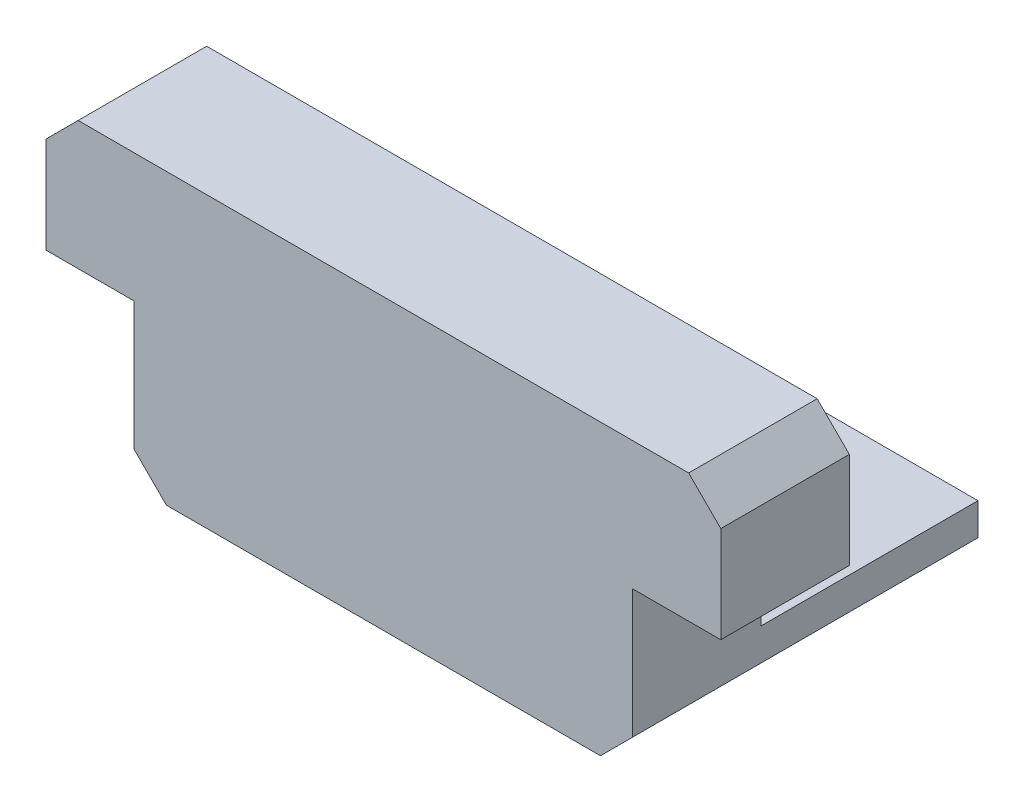
ISO-10303-21;
HEADER;
FILE_DESCRIPTION(('STEP AP214'),'2;1');
FILE_NAME('part.step','',(''),(''),'','','');
FILE_SCHEMA(('AUTOMOTIVE_DESIGN { 1 0 10303 214 1 1 1 1 }'));
ENDSEC;
DATA;
#1=APPLICATION_CONTEXT('core data for automotive mechanical design processes');
#2=APPLICATION_PROTOCOL_DEFINITION('international standard','automotive_design',2000,#1);
#3=PRODUCT_CONTEXT('',#1,'mechanical');
#4=PRODUCT('Part','Part','',(#3));
#5=PRODUCT_RELATED_PRODUCT_CATEGORY('part','',(#4));
#6=PRODUCT_DEFINITION_FORMATION('','',#4);
#7=PRODUCT_DEFINITION_CONTEXT('part definition',#1,'design');
#8=PRODUCT_DEFINITION('design','',#6,#7);
#9=PRODUCT_DEFINITION_SHAPE('','',#8);
#10=(LENGTH_UNIT() NAMED_UNIT(*) SI_UNIT(.MILLI.,.METRE.));
#11=(NAMED_UNIT(*) PLANE_ANGLE_UNIT() SI_UNIT($,.RADIAN.));
#12=(NAMED_UNIT(*) SI_UNIT($,.STERADIAN.) SOLID_ANGLE_UNIT());
#13=UNCERTAINTY_MEASURE_WITH_UNIT(LENGTH_MEASURE(1.E-05),#10,'distance_accuracy_value','');
#14=(GEOMETRIC_REPRESENTATION_CONTEXT(3) GLOBAL_UNCERTAINTY_ASSIGNED_CONTEXT((#13)) GLOBAL_UNIT_ASSIGNED_CONTEXT((#10,
#11,#12)) REPRESENTATION_CONTEXT('',''));
#15=CARTESIAN_POINT('',(0.,0.,0.));
#16=DIRECTION('',(0.,0.,1.));
#17=DIRECTION('',(1.,0.,0.));
#18=AXIS2_PLACEMENT_3D('',#15,#16,#17);
#19=CARTESIAN_POINT('',(-5.5,15.9904714002546,21.5));
#20=DIRECTION('',(1.,0.,0.));
#21=DIRECTION('',(0.,1.,0.));
#22=AXIS2_PLACEMENT_3D('',#19,#20,#21);
#23=PLANE('',#22);
#24=DIRECTION('',(0.,1.,0.));
#25=VECTOR('',#24,1.);
#26=CARTESIAN_POINT('',(-5.5,15.9904714002546,13.5));
#27=LINE('',#26,#25);
#28=CARTESIAN_POINT('',(-5.5,10.,13.5));
#29=VERTEX_POINT('',#28);
#30=CARTESIAN_POINT('',(-5.5,15.9904714002546,13.5));
#31=VERTEX_POINT('',#30);
#32=EDGE_CURVE('E260',#29,#31,#27,.T.);
#33=ORIENTED_EDGE('',*,*,#32,.F.);
#34=DIRECTION('',(0.,0.,-1.));
#35=VECTOR('',#34,1.);
#36=CARTESIAN_POINT('',(-5.5,10.,21.5));
#37=LINE('',#36,#35);
#38=CARTESIAN_POINT('',(-5.5,10.,21.5));
#39=VERTEX_POINT('',#38);
#40=EDGE_CURVE('E178',#39,#29,#37,.T.);
#41=ORIENTED_EDGE('',*,*,#40,.F.);
#42=DIRECTION('',(0.,-1.,0.));
#43=VECTOR('',#42,1.);
#44=CARTESIAN_POINT('',(-5.5,15.9904714002546,21.5));
#45=LINE('',#44,#43);
#46=CARTESIAN_POINT('',(-5.5,15.9904714002546,21.5));
#47=VERTEX_POINT('',#46);
#48=EDGE_CURVE('E154',#47,#39,#45,.T.);
#49=ORIENTED_EDGE('',*,*,#48,.F.);
#50=DIRECTION('',(0.,0.,-1.));
#51=VECTOR('',#50,1.);
#52=CARTESIAN_POINT('',(-5.5,15.9904714002546,21.5));
#53=LINE('',#52,#51);
#54=EDGE_CURVE('E139',#47,#31,#53,.T.);
#55=ORIENTED_EDGE('',*,*,#54,.T.);
#56=EDGE_LOOP('',(#33,#41,#49,#55));
#57=FACE_BOUND('',#56,.T.);
#58=ADVANCED_FACE('F31',(#57),#23,.F.);
#59=CARTESIAN_POINT('',(-0.00952859974536965,10.,21.5));
#60=DIRECTION('',(0.,1.,0.));
#61=DIRECTION('',(0.,0.,1.));
#62=AXIS2_PLACEMENT_3D('',#59,#60,#61);
#63=PLANE('',#62);
#64=DIRECTION('',(-1.,0.,0.));
#65=VECTOR('',#64,1.);
#66=CARTESIAN_POINT('',(-0.00952859974536965,10.,13.5));
#67=LINE('',#66,#65);
#68=CARTESIAN_POINT('',(-0.00952859974536965,10.,13.5));
#69=VERTEX_POINT('',#68);
#70=EDGE_CURVE('E251',#69,#29,#67,.T.);
#71=ORIENTED_EDGE('',*,*,#70,.F.);
#72=DIRECTION('',(0.,0.,-1.));
#73=VECTOR('',#72,1.);
#74=CARTESIAN_POINT('',(-0.00952859974536965,10.,21.5));
#75=LINE('',#74,#73);
#76=CARTESIAN_POINT('',(-0.00952859974536965,10.,21.5));
#77=VERTEX_POINT('',#76);
#78=EDGE_CURVE('E175',#77,#69,#75,.T.);
#79=ORIENTED_EDGE('',*,*,#78,.F.);
#80=DIRECTION('',(1.,0.,0.));
#81=VECTOR('',#80,1.);
#82=CARTESIAN_POINT('',(-0.00952859974536965,10.,21.5));
#83=LINE('',#82,#81);
#84=EDGE_CURVE('E85',#39,#77,#83,.T.);
#85=ORIENTED_EDGE('',*,*,#84,.F.);
#86=ORIENTED_EDGE('',*,*,#40,.T.);
#87=EDGE_LOOP('',(#71,#79,#85,#86));
#88=FACE_BOUND('',#87,.T.);
#89=ADVANCED_FACE('F257',(#88),#63,.F.);
#90=CARTESIAN_POINT('',(31.0095285997454,10.,21.5));
#91=DIRECTION('',(0.,1.,0.));
#92=DIRECTION('',(0.,0.,1.));
#93=AXIS2_PLACEMENT_3D('',#90,#91,#92);
#94=PLANE('',#93);
#95=DIRECTION('',(-1.,0.,0.));
#96=VECTOR('',#95,1.);
#97=CARTESIAN_POINT('',(31.0095285997454,10.,13.5));
#98=LINE('',#97,#96);
#99=CARTESIAN_POINT('',(36.5,10.,13.5));
#100=VERTEX_POINT('',#99);
#101=CARTESIAN_POINT('',(31.0095285997454,10.,13.5));
#102=VERTEX_POINT('',#101);
#103=EDGE_CURVE('E231',#100,#102,#98,.T.);
#104=ORIENTED_EDGE('',*,*,#103,.F.);
#105=DIRECTION('',(0.,0.,-1.));
#106=VECTOR('',#105,1.);
#107=CARTESIAN_POINT('',(36.5,10.,21.5));
#108=LINE('',#107,#106);
#109=CARTESIAN_POINT('',(36.5,10.,21.5));
#110=VERTEX_POINT('',#109);
#111=EDGE_CURVE('E159',#110,#100,#108,.T.);
#112=ORIENTED_EDGE('',*,*,#111,.F.);
#113=DIRECTION('',(1.,0.,0.));
#114=VECTOR('',#113,1.);
#115=CARTESIAN_POINT('',(31.0095285997454,10.,21.5));
#116=LINE('',#115,#114);
#117=CARTESIAN_POINT('',(31.0095285997454,10.,21.5));
#118=VERTEX_POINT('',#117);
#119=EDGE_CURVE('E221',#118,#110,#116,.T.);
#120=ORIENTED_EDGE('',*,*,#119,.F.);
#121=DIRECTION('',(0.,0.,-1.));
#122=VECTOR('',#121,1.);
#123=CARTESIAN_POINT('',(31.0095285997454,10.,21.5));
#124=LINE('',#123,#122);
#125=EDGE_CURVE('E162',#118,#102,#124,.T.);
#126=ORIENTED_EDGE('',*,*,#125,.T.);
#127=EDGE_LOOP('',(#104,#112,#120,#126));
#128=FACE_BOUND('',#127,.T.);
#129=ADVANCED_FACE('F228',(#128),#94,.F.);
#130=CARTESIAN_POINT('',(36.5,15.9904714002546,21.5));
#131=DIRECTION('',(-1.,0.,0.));
#132=DIRECTION('',(0.,0.,1.));
#133=AXIS2_PLACEMENT_3D('',#130,#131,#132);
#134=PLANE('',#133);
#135=DIRECTION('',(0.,-1.,0.));
#136=VECTOR('',#135,1.);
#137=CARTESIAN_POINT('',(36.5,15.9904714002546,13.5));
#138=LINE('',#137,#136);
#139=CARTESIAN_POINT('',(36.5,15.9904714002546,13.5));
#140=VERTEX_POINT('',#139);
#141=EDGE_CURVE('E237',#140,#100,#138,.T.);
#142=ORIENTED_EDGE('',*,*,#141,.F.);
#143=DIRECTION('',(0.,0.,-1.));
#144=VECTOR('',#143,1.);
#145=CARTESIAN_POINT('',(36.5,15.9904714002546,21.5));
#146=LINE('',#145,#144);
#147=CARTESIAN_POINT('',(36.5,15.9904714002546,21.5));
#148=VERTEX_POINT('',#147);
#149=EDGE_CURVE('E133',#148,#140,#146,.T.);
#150=ORIENTED_EDGE('',*,*,#149,.F.);
#151=DIRECTION('',(0.,1.,0.));
#152=VECTOR('',#151,1.);
#153=CARTESIAN_POINT('',(36.5,15.9904714002546,21.5));
#154=LINE('',#153,#152);
#155=EDGE_CURVE('E119',#110,#148,#154,.T.);
#156=ORIENTED_EDGE('',*,*,#155,.F.);
#157=ORIENTED_EDGE('',*,*,#111,.T.);
#158=EDGE_LOOP('',(#142,#150,#156,#157));
#159=FACE_BOUND('',#158,.T.);
#160=ADVANCED_FACE('F234',(#159),#134,.F.);
#161=CARTESIAN_POINT('',(34.5,17.9904714002546,21.5));
#162=DIRECTION('',(-0.707106781186547,-0.707106781186547,0.));
#163=DIRECTION('',(0.707106781186548,-0.707106781186548,0.));
#164=AXIS2_PLACEMENT_3D('',#161,#162,#163);
#165=PLANE('',#164);
#166=DIRECTION('',(0.707106781186548,-0.707106781186548,0.));
#167=VECTOR('',#166,1.);
#168=CARTESIAN_POINT('',(34.5,17.9904714002546,13.5));
#169=LINE('',#168,#167);
#170=CARTESIAN_POINT('',(34.5,17.9904714002546,13.5));
#171=VERTEX_POINT('',#170);
#172=EDGE_CURVE('E130',#171,#140,#169,.T.);
#173=ORIENTED_EDGE('',*,*,#172,.F.);
#174=DIRECTION('',(0.,0.,-1.));
#175=VECTOR('',#174,1.);
#176=CARTESIAN_POINT('',(34.5,17.9904714002546,21.5));
#177=LINE('',#176,#175);
#178=CARTESIAN_POINT('',(34.5,17.9904714002546,21.5));
#179=VERTEX_POINT('',#178);
#180=EDGE_CURVE('E126',#179,#171,#177,.T.);
#181=ORIENTED_EDGE('',*,*,#180,.F.);
#182=DIRECTION('',(-0.707106781186547,0.707106781186547,0.));
#183=VECTOR('',#182,1.);
#184=CARTESIAN_POINT('',(34.5,17.9904714002546,21.5));
#185=LINE('',#184,#183);
#186=EDGE_CURVE('E112',#148,#179,#185,.T.);
#187=ORIENTED_EDGE('',*,*,#186,.F.);
#188=ORIENTED_EDGE('',*,*,#149,.T.);
#189=EDGE_LOOP('',(#173,#181,#187,#188));
#190=FACE_BOUND('',#189,.T.);
#191=ADVANCED_FACE('F127',(#190),#165,.F.);
#192=CARTESIAN_POINT('',(-3.5,17.9904714002546,21.5));
#193=DIRECTION('',(0.,-1.,0.));
#194=DIRECTION('',(0.,0.,-1.));
#195=AXIS2_PLACEMENT_3D('',#192,#193,#194);
#196=PLANE('',#195);
#197=DIRECTION('',(1.,0.,0.));
#198=VECTOR('',#197,1.);
#199=CARTESIAN_POINT('',(-3.5,17.9904714002546,13.5));
#200=LINE('',#199,#198);
#201=CARTESIAN_POINT('',(-3.5,17.9904714002546,13.5));
#202=VERTEX_POINT('',#201);
#203=EDGE_CURVE('E196',#202,#171,#200,.T.);
#204=ORIENTED_EDGE('',*,*,#203,.F.);
#205=DIRECTION('',(0.,0.,-1.));
#206=VECTOR('',#205,1.);
#207=CARTESIAN_POINT('',(-3.5,17.9904714002546,21.5));
#208=LINE('',#207,#206);
#209=CARTESIAN_POINT('',(-3.5,17.9904714002546,21.5));
#210=VERTEX_POINT('',#209);
#211=EDGE_CURVE('E134',#210,#202,#208,.T.);
#212=ORIENTED_EDGE('',*,*,#211,.F.);
#213=DIRECTION('',(-1.,0.,0.));
#214=VECTOR('',#213,1.);
#215=CARTESIAN_POINT('',(-3.5,17.9904714002546,21.5));
#216=LINE('',#215,#214);
#217=EDGE_CURVE('E116',#179,#210,#216,.T.);
#218=ORIENTED_EDGE('',*,*,#217,.F.);
#219=ORIENTED_EDGE('',*,*,#180,.T.);
#220=EDGE_LOOP('',(#204,#212,#218,#219));
#221=FACE_BOUND('',#220,.T.);
#222=ADVANCED_FACE('F136',(#221),#196,.F.);
#223=CARTESIAN_POINT('',(-3.5,17.9904714002546,21.5));
#224=DIRECTION('',(0.707106781186548,-0.707106781186547,0.));
#225=DIRECTION('',(0.707106781186547,0.707106781186548,0.));
#226=AXIS2_PLACEMENT_3D('',#223,#224,#225);
#227=PLANE('',#226);
#228=DIRECTION('',(0.707106781186547,0.707106781186548,0.));
#229=VECTOR('',#228,1.);
#230=CARTESIAN_POINT('',(-3.5,17.9904714002546,13.5));
#231=LINE('',#230,#229);
#232=EDGE_CURVE('E11',#31,#202,#231,.T.);
#233=ORIENTED_EDGE('',*,*,#232,.F.);
#234=ORIENTED_EDGE('',*,*,#54,.F.);
#235=DIRECTION('',(-0.707106781186547,-0.707106781186548,0.));
#236=VECTOR('',#235,1.);
#237=CARTESIAN_POINT('',(-3.5,17.9904714002546,21.5));
#238=LINE('',#237,#236);
#239=EDGE_CURVE('E54',#210,#47,#238,.T.);
#240=ORIENTED_EDGE('',*,*,#239,.F.);
#241=ORIENTED_EDGE('',*,*,#211,.T.);
#242=EDGE_LOOP('',(#233,#234,#240,#241));
#243=FACE_BOUND('',#242,.T.);
#244=ADVANCED_FACE('F282',(#243),#227,.F.);
#245=CARTESIAN_POINT('',(-0.00952859974536965,1.99999999999999,21.5));
#246=DIRECTION('',(1.,0.,0.));
#247=DIRECTION('',(0.,0.,-1.));
#248=AXIS2_PLACEMENT_3D('',#245,#246,#247);
#249=PLANE('',#248);
#250=DIRECTION('',(0.,1.,0.));
#251=VECTOR('',#250,1.);
#252=CARTESIAN_POINT('',(-0.00952859974536965,1.99999999999999,13.5));
#253=LINE('',#252,#251);
#254=CARTESIAN_POINT('',(-0.00952859974537312,4.,13.5));
#255=VERTEX_POINT('',#254);
#256=EDGE_CURVE('E146',#255,#69,#253,.T.);
#257=ORIENTED_EDGE('',*,*,#256,.F.);
#258=DIRECTION('',(0.,0.,-1.));
#259=VECTOR('',#258,1.);
#260=CARTESIAN_POINT('',(-0.00952859974536965,4.,21.5));
#261=LINE('',#260,#259);
#262=CARTESIAN_POINT('',(-0.00952859974537312,4.,0.));
#263=VERTEX_POINT('',#262);
#264=EDGE_CURVE('E184',#255,#263,#261,.T.);
#265=ORIENTED_EDGE('',*,*,#264,.T.);
#266=DIRECTION('',(0.,-1.,0.));
#267=VECTOR('',#266,1.);
#268=CARTESIAN_POINT('',(-0.00952859974536965,1.99999999999999,0.));
#269=LINE('',#268,#267);
#270=CARTESIAN_POINT('',(-0.00952859974536965,1.99999999999999,0.));
#271=VERTEX_POINT('',#270);
#272=EDGE_CURVE('E143',#263,#271,#269,.T.);
#273=ORIENTED_EDGE('',*,*,#272,.T.);
#274=DIRECTION('',(0.,0.,-1.));
#275=VECTOR('',#274,1.);
#276=CARTESIAN_POINT('',(-0.00952859974536965,1.99999999999999,21.5));
#277=LINE('',#276,#275);
#278=CARTESIAN_POINT('',(-0.00952859974536965,1.99999999999999,21.5));
#279=VERTEX_POINT('',#278);
#280=EDGE_CURVE('E172',#279,#271,#277,.T.);
#281=ORIENTED_EDGE('',*,*,#280,.F.);
#282=DIRECTION('',(0.,-1.,0.));
#283=VECTOR('',#282,1.);
#284=CARTESIAN_POINT('',(-0.00952859974536965,1.99999999999999,21.5));
#285=LINE('',#284,#283);
#286=EDGE_CURVE('E216',#77,#279,#285,.T.);
#287=ORIENTED_EDGE('',*,*,#286,.F.);
#288=ORIENTED_EDGE('',*,*,#78,.T.);
#289=EDGE_LOOP('',(#257,#265,#273,#281,#287,#288));
#290=FACE_BOUND('',#289,.T.);
#291=ADVANCED_FACE('F193',(#290),#249,.F.);
#292=CARTESIAN_POINT('',(-0.00952859974536965,1.99999999999999,21.5));
#293=DIRECTION('',(0.707106781186539,0.707106781186556,0.));
#294=DIRECTION('',(-0.707106781186556,0.707106781186539,0.));
#295=AXIS2_PLACEMENT_3D('',#292,#293,#294);
#296=PLANE('',#295);
#297=DIRECTION('',(0.707106781186556,-0.707106781186539,0.));
#298=VECTOR('',#297,1.);
#299=CARTESIAN_POINT('',(-0.00952859974536965,1.99999999999999,0.));
#300=LINE('',#299,#298);
#301=CARTESIAN_POINT('',(1.99047140025467,0.,0.));
#302=VERTEX_POINT('',#301);
#303=EDGE_CURVE('E145',#271,#302,#300,.T.);
#304=ORIENTED_EDGE('',*,*,#303,.T.);
#305=DIRECTION('',(0.,0.,-1.));
#306=VECTOR('',#305,1.);
#307=CARTESIAN_POINT('',(1.99047140025467,0.,21.5));
#308=LINE('',#307,#306);
#309=CARTESIAN_POINT('',(1.99047140025467,0.,21.5));
#310=VERTEX_POINT('',#309);
#311=EDGE_CURVE('E169',#310,#302,#308,.T.);
#312=ORIENTED_EDGE('',*,*,#311,.F.);
#313=DIRECTION('',(0.707106781186556,-0.707106781186539,0.));
#314=VECTOR('',#313,1.);
#315=CARTESIAN_POINT('',(-0.00952859974536965,1.99999999999999,21.5));
#316=LINE('',#315,#314);
#317=EDGE_CURVE('E212',#279,#310,#316,.T.);
#318=ORIENTED_EDGE('',*,*,#317,.F.);
#319=ORIENTED_EDGE('',*,*,#280,.T.);
#320=EDGE_LOOP('',(#304,#312,#318,#319));
#321=FACE_BOUND('',#320,.T.);
#322=ADVANCED_FACE('F203',(#321),#296,.F.);
#323=CARTESIAN_POINT('',(1.99047140025467,0.,21.5));
#324=DIRECTION('',(0.,1.,0.));
#325=DIRECTION('',(0.,0.,1.));
#326=AXIS2_PLACEMENT_3D('',#323,#324,#325);
#327=PLANE('',#326);
#328=DIRECTION('',(1.,0.,0.));
#329=VECTOR('',#328,1.);
#330=CARTESIAN_POINT('',(1.99047140025467,0.,0.));
#331=LINE('',#330,#329);
#332=CARTESIAN_POINT('',(29.0095285997453,0.,0.));
#333=VERTEX_POINT('',#332);
#334=EDGE_CURVE('E148',#302,#333,#331,.T.);
#335=ORIENTED_EDGE('',*,*,#334,.T.);
#336=DIRECTION('',(0.,0.,-1.));
#337=VECTOR('',#336,1.);
#338=CARTESIAN_POINT('',(29.0095285997453,0.,21.5));
#339=LINE('',#338,#337);
#340=CARTESIAN_POINT('',(29.0095285997453,0.,21.5));
#341=VERTEX_POINT('',#340);
#342=EDGE_CURVE('E167',#341,#333,#339,.T.);
#343=ORIENTED_EDGE('',*,*,#342,.F.);
#344=DIRECTION('',(1.,0.,0.));
#345=VECTOR('',#344,1.);
#346=CARTESIAN_POINT('',(1.99047140025467,0.,21.5));
#347=LINE('',#346,#345);
#348=EDGE_CURVE('E209',#310,#341,#347,.T.);
#349=ORIENTED_EDGE('',*,*,#348,.F.);
#350=ORIENTED_EDGE('',*,*,#311,.T.);
#351=EDGE_LOOP('',(#335,#343,#349,#350));
#352=FACE_BOUND('',#351,.T.);
#353=ADVANCED_FACE('F207',(#352),#327,.F.);
#354=CARTESIAN_POINT('',(31.0095285997454,1.99999999999999,21.5));
#355=DIRECTION('',(-0.707106781186539,0.707106781186556,0.));
#356=DIRECTION('',(-0.707106781186556,-0.707106781186539,0.));
#357=AXIS2_PLACEMENT_3D('',#354,#355,#356);
#358=PLANE('',#357);
#359=DIRECTION('',(0.707106781186556,0.707106781186539,0.));
#360=VECTOR('',#359,1.);
#361=CARTESIAN_POINT('',(31.0095285997454,1.99999999999999,0.));
#362=LINE('',#361,#360);
#363=CARTESIAN_POINT('',(31.0095285997454,1.99999999999999,0.));
#364=VERTEX_POINT('',#363);
#365=EDGE_CURVE('E76',#333,#364,#362,.T.);
#366=ORIENTED_EDGE('',*,*,#365,.T.);
#367=DIRECTION('',(0.,0.,-1.));
#368=VECTOR('',#367,1.);
#369=CARTESIAN_POINT('',(31.0095285997454,1.99999999999999,21.5));
#370=LINE('',#369,#368);
#371=CARTESIAN_POINT('',(31.0095285997454,1.99999999999999,21.5));
#372=VERTEX_POINT('',#371);
#373=EDGE_CURVE('E165',#372,#364,#370,.T.);
#374=ORIENTED_EDGE('',*,*,#373,.F.);
#375=DIRECTION('',(0.707106781186556,0.707106781186539,0.));
#376=VECTOR('',#375,1.);
#377=CARTESIAN_POINT('',(31.0095285997454,1.99999999999999,21.5));
#378=LINE('',#377,#376);
#379=EDGE_CURVE('E211',#341,#372,#378,.T.);
#380=ORIENTED_EDGE('',*,*,#379,.F.);
#381=ORIENTED_EDGE('',*,*,#342,.T.);
#382=EDGE_LOOP('',(#366,#374,#380,#381));
#383=FACE_BOUND('',#382,.T.);
#384=ADVANCED_FACE('F300',(#383),#358,.F.);
#385=CARTESIAN_POINT('',(31.0095285997454,1.99999999999999,21.5));
#386=DIRECTION('',(-1.,0.,0.));
#387=DIRECTION('',(0.,0.,1.));
#388=AXIS2_PLACEMENT_3D('',#385,#386,#387);
#389=PLANE('',#388);
#390=DIRECTION('',(0.,1.,0.));
#391=VECTOR('',#390,1.);
#392=CARTESIAN_POINT('',(31.0095285997454,1.99999999999999,0.));
#393=LINE('',#392,#391);
#394=CARTESIAN_POINT('',(31.0095285997454,4.,0.));
#395=VERTEX_POINT('',#394);
#396=EDGE_CURVE('E151',#364,#395,#393,.T.);
#397=ORIENTED_EDGE('',*,*,#396,.T.);
#398=DIRECTION('',(0.,0.,1.));
#399=VECTOR('',#398,1.);
#400=CARTESIAN_POINT('',(31.0095285997454,4.,21.5));
#401=LINE('',#400,#399);
#402=CARTESIAN_POINT('',(31.0095285997454,4.,13.5));
#403=VERTEX_POINT('',#402);
#404=EDGE_CURVE('E45',#395,#403,#401,.T.);
#405=ORIENTED_EDGE('',*,*,#404,.T.);
#406=DIRECTION('',(0.,-1.,0.));
#407=VECTOR('',#406,1.);
#408=CARTESIAN_POINT('',(31.0095285997454,1.99999999999999,13.5));
#409=LINE('',#408,#407);
#410=EDGE_CURVE('E266',#102,#403,#409,.T.);
#411=ORIENTED_EDGE('',*,*,#410,.F.);
#412=ORIENTED_EDGE('',*,*,#125,.F.);
#413=DIRECTION('',(0.,1.,0.));
#414=VECTOR('',#413,1.);
#415=CARTESIAN_POINT('',(31.0095285997454,1.99999999999999,21.5));
#416=LINE('',#415,#414);
#417=EDGE_CURVE('E214',#372,#118,#416,.T.);
#418=ORIENTED_EDGE('',*,*,#417,.F.);
#419=ORIENTED_EDGE('',*,*,#373,.T.);
#420=EDGE_LOOP('',(#397,#405,#411,#412,#418,#419));
#421=FACE_BOUND('',#420,.T.);
#422=ADVANCED_FACE('F275',(#421),#389,.F.);
#423=CARTESIAN_POINT('',(-5.5,10.,21.5));
#424=DIRECTION('',(0.,0.,-1.));
#425=DIRECTION('',(-1.,0.,0.));
#426=AXIS2_PLACEMENT_3D('',#423,#424,#425);
#427=PLANE('',#426);
#428=ORIENTED_EDGE('',*,*,#48,.T.);
#429=ORIENTED_EDGE('',*,*,#84,.T.);
#430=ORIENTED_EDGE('',*,*,#286,.T.);
#431=ORIENTED_EDGE('',*,*,#317,.T.);
#432=ORIENTED_EDGE('',*,*,#348,.T.);
#433=ORIENTED_EDGE('',*,*,#379,.T.);
#434=ORIENTED_EDGE('',*,*,#417,.T.);
#435=ORIENTED_EDGE('',*,*,#119,.T.);
#436=ORIENTED_EDGE('',*,*,#155,.T.);
#437=ORIENTED_EDGE('',*,*,#186,.T.);
#438=ORIENTED_EDGE('',*,*,#217,.T.);
#439=ORIENTED_EDGE('',*,*,#239,.T.);
#440=EDGE_LOOP('',(#428,#429,#430,#431,#432,#433,#434,#435,#436,#437,#438,#439));
#441=FACE_BOUND('',#440,.T.);
#442=ADVANCED_FACE('F114',(#441),#427,.F.);
#443=CARTESIAN_POINT('',(-5.5,10.,0.));
#444=DIRECTION('',(0.,0.,-1.));
#445=DIRECTION('',(-1.,0.,0.));
#446=AXIS2_PLACEMENT_3D('',#443,#444,#445);
#447=PLANE('',#446);
#448=DIRECTION('',(-1.,0.,0.));
#449=VECTOR('',#448,1.);
#450=CARTESIAN_POINT('',(-5.5,4.,0.));
#451=LINE('',#450,#449);
#452=EDGE_CURVE('E38',#395,#263,#451,.T.);
#453=ORIENTED_EDGE('',*,*,#452,.F.);
#454=ORIENTED_EDGE('',*,*,#396,.F.);
#455=ORIENTED_EDGE('',*,*,#365,.F.);
#456=ORIENTED_EDGE('',*,*,#334,.F.);
#457=ORIENTED_EDGE('',*,*,#303,.F.);
#458=ORIENTED_EDGE('',*,*,#272,.F.);
#459=EDGE_LOOP('',(#453,#454,#455,#456,#457,#458));
#460=FACE_BOUND('',#459,.T.);
#461=ADVANCED_FACE('F199',(#460),#447,.T.);
#462=CARTESIAN_POINT('',(37.1561061446948,4.,13.5));
#463=DIRECTION('',(0.,0.,-1.));
#464=DIRECTION('',(-1.,0.,0.));
#465=AXIS2_PLACEMENT_3D('',#462,#463,#464);
#466=PLANE('',#465);
#467=ORIENTED_EDGE('',*,*,#256,.T.);
#468=ORIENTED_EDGE('',*,*,#70,.T.);
#469=ORIENTED_EDGE('',*,*,#32,.T.);
#470=ORIENTED_EDGE('',*,*,#232,.T.);
#471=ORIENTED_EDGE('',*,*,#203,.T.);
#472=ORIENTED_EDGE('',*,*,#172,.T.);
#473=ORIENTED_EDGE('',*,*,#141,.T.);
#474=ORIENTED_EDGE('',*,*,#103,.T.);
#475=ORIENTED_EDGE('',*,*,#410,.T.);
#476=DIRECTION('',(-1.,0.,0.));
#477=VECTOR('',#476,1.);
#478=CARTESIAN_POINT('',(37.1561061446948,4.,13.5));
#479=LINE('',#478,#477);
#480=EDGE_CURVE('E255',#403,#255,#479,.T.);
#481=ORIENTED_EDGE('',*,*,#480,.T.);
#482=EDGE_LOOP('',(#467,#468,#469,#470,#471,#472,#473,#474,#475,#481));
#483=FACE_BOUND('',#482,.T.);
#484=ADVANCED_FACE('F253',(#483),#466,.T.);
#485=CARTESIAN_POINT('',(37.1561061446948,4.,13.5));
#486=DIRECTION('',(0.,-1.,0.));
#487=DIRECTION('',(0.,0.,-1.));
#488=AXIS2_PLACEMENT_3D('',#485,#486,#487);
#489=PLANE('',#488);
#490=ORIENTED_EDGE('',*,*,#480,.F.);
#491=ORIENTED_EDGE('',*,*,#404,.F.);
#492=ORIENTED_EDGE('',*,*,#452,.T.);
#493=ORIENTED_EDGE('',*,*,#264,.F.);
#494=EDGE_LOOP('',(#490,#491,#492,#493));
#495=FACE_BOUND('',#494,.T.);
#496=ADVANCED_FACE('F182',(#495),#489,.F.);
#497=CLOSED_SHELL('',(#58,#89,#129,#160,#191,#222,#244,#291,#322,#353,#384,#422,#442,#461,#484,#496));
#498=MANIFOLD_SOLID_BREP('B2',#497);
#499=ADVANCED_BREP_SHAPE_REPRESENTATION('',(#18,#498),#14);
#500=SHAPE_DEFINITION_REPRESENTATION(#9,#499);
ENDSEC;
END-ISO-10303-21;
